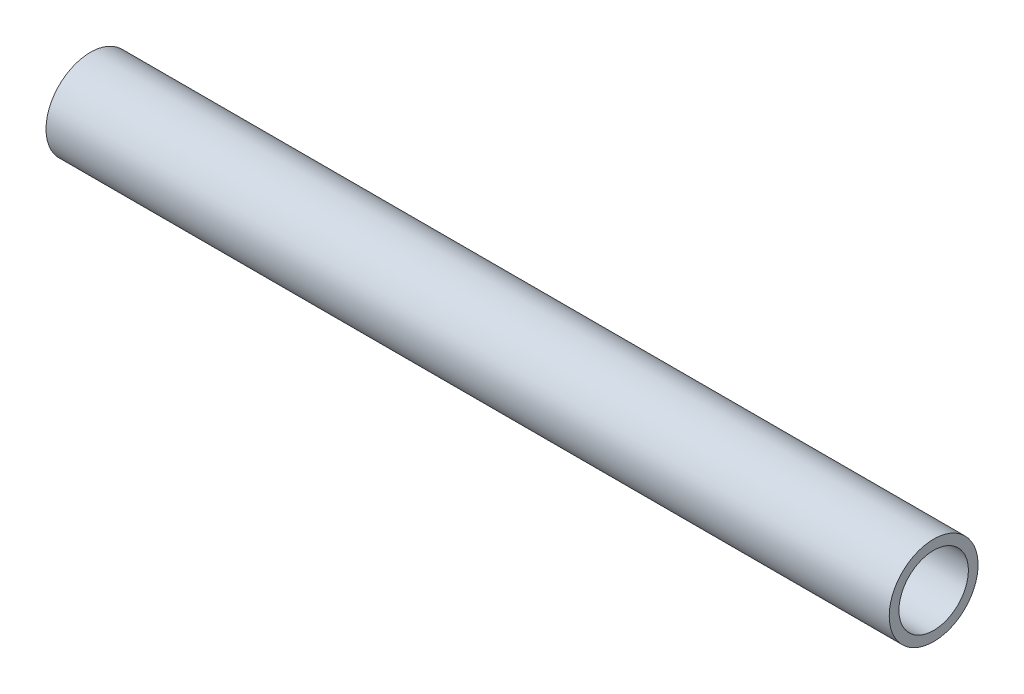
ISO-10303-21;
HEADER;
FILE_DESCRIPTION(('STEP AP214'),'2;1');
FILE_NAME('part.step','',(''),(''),'','','');
FILE_SCHEMA(('AUTOMOTIVE_DESIGN { 1 0 10303 214 1 1 1 1 }'));
ENDSEC;
DATA;
#1=APPLICATION_CONTEXT('core data for automotive mechanical design processes');
#2=APPLICATION_PROTOCOL_DEFINITION('international standard','automotive_design',2000,#1);
#3=PRODUCT_CONTEXT('',#1,'mechanical');
#4=PRODUCT('Part','Part','',(#3));
#5=PRODUCT_RELATED_PRODUCT_CATEGORY('part','',(#4));
#6=PRODUCT_DEFINITION_FORMATION('','',#4);
#7=PRODUCT_DEFINITION_CONTEXT('part definition',#1,'design');
#8=PRODUCT_DEFINITION('design','',#6,#7);
#9=PRODUCT_DEFINITION_SHAPE('','',#8);
#10=(LENGTH_UNIT() NAMED_UNIT(*) SI_UNIT(.MILLI.,.METRE.));
#11=(NAMED_UNIT(*) PLANE_ANGLE_UNIT() SI_UNIT($,.RADIAN.));
#12=(NAMED_UNIT(*) SI_UNIT($,.STERADIAN.) SOLID_ANGLE_UNIT());
#13=UNCERTAINTY_MEASURE_WITH_UNIT(LENGTH_MEASURE(1.E-05),#10,'distance_accuracy_value','');
#14=(GEOMETRIC_REPRESENTATION_CONTEXT(3) GLOBAL_UNCERTAINTY_ASSIGNED_CONTEXT((#13)) GLOBAL_UNIT_ASSIGNED_CONTEXT((#10,
#11,#12)) REPRESENTATION_CONTEXT('',''));
#15=CARTESIAN_POINT('',(0.,0.,0.));
#16=DIRECTION('',(0.,0.,1.));
#17=DIRECTION('',(1.,0.,0.));
#18=AXIS2_PLACEMENT_3D('',#15,#16,#17);
#19=CARTESIAN_POINT('',(-1000.,0.,0.));
#20=DIRECTION('',(-1.,0.,0.));
#21=DIRECTION('',(0.,0.,1.));
#22=AXIS2_PLACEMENT_3D('',#19,#20,#21);
#23=CYLINDRICAL_SURFACE('',#22,5.35);
#24=CARTESIAN_POINT('',(64.9999999999999,0.,0.));
#25=DIRECTION('',(-1.,0.,0.));
#26=DIRECTION('',(0.,0.,1.));
#27=AXIS2_PLACEMENT_3D('',#24,#25,#26);
#28=CIRCLE('',#27,5.35);
#29=CARTESIAN_POINT('',(64.9999999999999,0.,5.35));
#30=VERTEX_POINT('',#29);
#31=EDGE_CURVE('E52',#30,#30,#28,.T.);
#32=ORIENTED_EDGE('',*,*,#31,.F.);
#33=EDGE_LOOP('',(#32));
#34=FACE_BOUND('',#33,.T.);
#35=CARTESIAN_POINT('',(-64.9999999999999,0.,0.));
#36=DIRECTION('',(-1.,0.,0.));
#37=DIRECTION('',(0.,0.,1.));
#38=AXIS2_PLACEMENT_3D('',#35,#36,#37);
#39=CIRCLE('',#38,5.35);
#40=CARTESIAN_POINT('',(-64.9999999999999,0.,5.35));
#41=VERTEX_POINT('',#40);
#42=EDGE_CURVE('E10',#41,#41,#39,.T.);
#43=ORIENTED_EDGE('',*,*,#42,.T.);
#44=EDGE_LOOP('',(#43));
#45=FACE_BOUND('',#44,.T.);
#46=ADVANCED_FACE('F39',(#34,#45),#23,.F.);
#47=CARTESIAN_POINT('',(-65.,5.35,0.));
#48=DIRECTION('',(1.,0.,0.));
#49=DIRECTION('',(0.,0.,-1.));
#50=AXIS2_PLACEMENT_3D('',#47,#48,#49);
#51=PLANE('',#50);
#52=ORIENTED_EDGE('',*,*,#42,.F.);
#53=EDGE_LOOP('',(#52));
#54=FACE_BOUND('',#53,.T.);
#55=CARTESIAN_POINT('',(-64.9999999999999,0.,0.));
#56=DIRECTION('',(-1.,0.,0.));
#57=DIRECTION('',(0.,0.,1.));
#58=AXIS2_PLACEMENT_3D('',#55,#56,#57);
#59=CIRCLE('',#58,6.85);
#60=CARTESIAN_POINT('',(-64.9999999999999,0.,6.85));
#61=VERTEX_POINT('',#60);
#62=EDGE_CURVE('E44',#61,#61,#59,.T.);
#63=ORIENTED_EDGE('',*,*,#62,.T.);
#64=EDGE_LOOP('',(#63));
#65=FACE_BOUND('',#64,.T.);
#66=ADVANCED_FACE('F65',(#54,#65),#51,.F.);
#67=CARTESIAN_POINT('',(-1000.,0.,0.));
#68=DIRECTION('',(-1.,0.,0.));
#69=DIRECTION('',(0.,0.,1.));
#70=AXIS2_PLACEMENT_3D('',#67,#68,#69);
#71=CYLINDRICAL_SURFACE('',#70,6.85);
#72=ORIENTED_EDGE('',*,*,#62,.F.);
#73=EDGE_LOOP('',(#72));
#74=FACE_BOUND('',#73,.T.);
#75=CARTESIAN_POINT('',(64.9999999999999,0.,0.));
#76=DIRECTION('',(-1.,0.,0.));
#77=DIRECTION('',(0.,0.,1.));
#78=AXIS2_PLACEMENT_3D('',#75,#76,#77);
#79=CIRCLE('',#78,6.85);
#80=CARTESIAN_POINT('',(64.9999999999999,0.,6.85));
#81=VERTEX_POINT('',#80);
#82=EDGE_CURVE('E47',#81,#81,#79,.T.);
#83=ORIENTED_EDGE('',*,*,#82,.T.);
#84=EDGE_LOOP('',(#83));
#85=FACE_BOUND('',#84,.T.);
#86=ADVANCED_FACE('F67',(#74,#85),#71,.T.);
#87=CARTESIAN_POINT('',(65.,6.85,0.));
#88=DIRECTION('',(-1.,0.,0.));
#89=DIRECTION('',(0.,0.,1.));
#90=AXIS2_PLACEMENT_3D('',#87,#88,#89);
#91=PLANE('',#90);
#92=ORIENTED_EDGE('',*,*,#82,.F.);
#93=EDGE_LOOP('',(#92));
#94=FACE_BOUND('',#93,.T.);
#95=ORIENTED_EDGE('',*,*,#31,.T.);
#96=EDGE_LOOP('',(#95));
#97=FACE_BOUND('',#96,.T.);
#98=ADVANCED_FACE('F56',(#94,#97),#91,.F.);
#99=CLOSED_SHELL('',(#46,#66,#86,#98));
#100=MANIFOLD_SOLID_BREP('B2',#99);
#101=ADVANCED_BREP_SHAPE_REPRESENTATION('',(#18,#100),#14);
#102=SHAPE_DEFINITION_REPRESENTATION(#9,#101);
ENDSEC;
END-ISO-10303-21;
